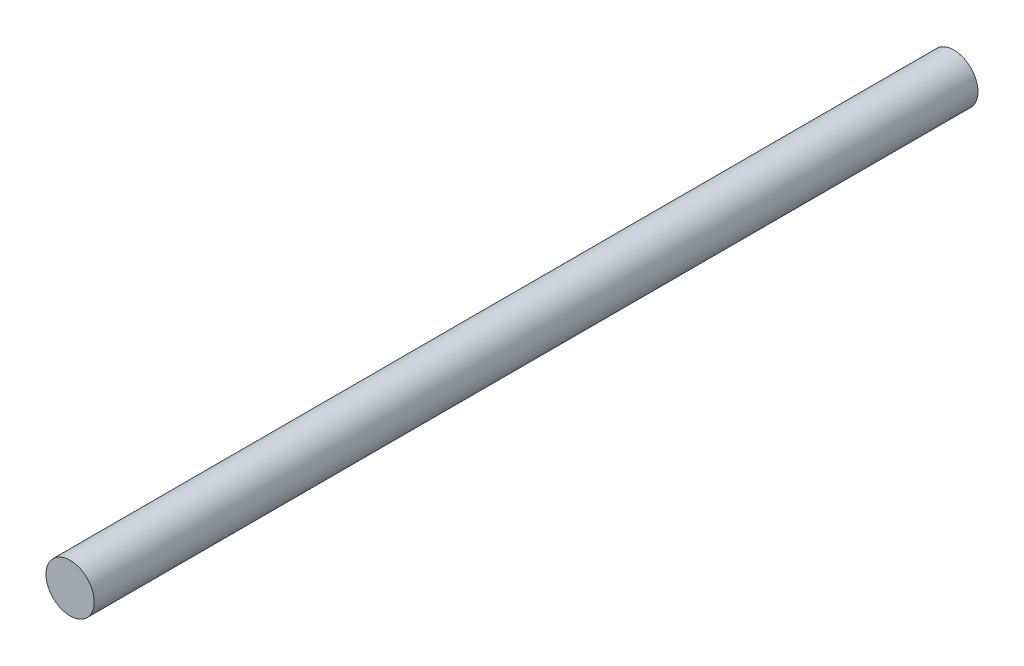
ISO-10303-21;
HEADER;
FILE_DESCRIPTION(('STEP AP214'),'2;1');
FILE_NAME('part.step','',(''),(''),'','','');
FILE_SCHEMA(('AUTOMOTIVE_DESIGN { 1 0 10303 214 1 1 1 1 }'));
ENDSEC;
DATA;
#1=APPLICATION_CONTEXT('core data for automotive mechanical design processes');
#2=APPLICATION_PROTOCOL_DEFINITION('international standard','automotive_design',2000,#1);
#3=PRODUCT_CONTEXT('',#1,'mechanical');
#4=PRODUCT('Part','Part','',(#3));
#5=PRODUCT_RELATED_PRODUCT_CATEGORY('part','',(#4));
#6=PRODUCT_DEFINITION_FORMATION('','',#4);
#7=PRODUCT_DEFINITION_CONTEXT('part definition',#1,'design');
#8=PRODUCT_DEFINITION('design','',#6,#7);
#9=PRODUCT_DEFINITION_SHAPE('','',#8);
#10=(LENGTH_UNIT() NAMED_UNIT(*) SI_UNIT(.MILLI.,.METRE.));
#11=(NAMED_UNIT(*) PLANE_ANGLE_UNIT() SI_UNIT($,.RADIAN.));
#12=(NAMED_UNIT(*) SI_UNIT($,.STERADIAN.) SOLID_ANGLE_UNIT());
#13=UNCERTAINTY_MEASURE_WITH_UNIT(LENGTH_MEASURE(1.E-05),#10,'distance_accuracy_value','');
#14=(GEOMETRIC_REPRESENTATION_CONTEXT(3) GLOBAL_UNCERTAINTY_ASSIGNED_CONTEXT((#13)) GLOBAL_UNIT_ASSIGNED_CONTEXT((#10,
#11,#12)) REPRESENTATION_CONTEXT('',''));
#15=CARTESIAN_POINT('',(0.,0.,0.));
#16=DIRECTION('',(0.,0.,1.));
#17=DIRECTION('',(1.,0.,0.));
#18=AXIS2_PLACEMENT_3D('',#15,#16,#17);
#19=CARTESIAN_POINT('',(0.,0.,293.));
#20=DIRECTION('',(0.,0.,-1.));
#21=DIRECTION('',(-1.,0.,0.));
#22=AXIS2_PLACEMENT_3D('',#19,#20,#21);
#23=CYLINDRICAL_SURFACE('',#22,8.);
#24=CARTESIAN_POINT('',(0.,0.,293.));
#25=DIRECTION('',(0.,0.,1.));
#26=DIRECTION('',(1.,0.,0.));
#27=AXIS2_PLACEMENT_3D('',#24,#25,#26);
#28=CIRCLE('',#27,8.);
#29=CARTESIAN_POINT('',(8.,0.,293.));
#30=VERTEX_POINT('',#29);
#31=EDGE_CURVE('E10',#30,#30,#28,.T.);
#32=ORIENTED_EDGE('',*,*,#31,.F.);
#33=EDGE_LOOP('',(#32));
#34=FACE_BOUND('',#33,.T.);
#35=CARTESIAN_POINT('',(0.,0.,0.));
#36=DIRECTION('',(0.,0.,1.));
#37=DIRECTION('',(1.,0.,0.));
#38=AXIS2_PLACEMENT_3D('',#35,#36,#37);
#39=CIRCLE('',#38,8.);
#40=CARTESIAN_POINT('',(8.,0.,0.));
#41=VERTEX_POINT('',#40);
#42=EDGE_CURVE('E36',#41,#41,#39,.T.);
#43=ORIENTED_EDGE('',*,*,#42,.T.);
#44=EDGE_LOOP('',(#43));
#45=FACE_BOUND('',#44,.T.);
#46=ADVANCED_FACE('F33',(#34,#45),#23,.T.);
#47=CARTESIAN_POINT('',(0.,0.,293.));
#48=DIRECTION('',(0.,0.,1.));
#49=DIRECTION('',(1.,0.,0.));
#50=AXIS2_PLACEMENT_3D('',#47,#48,#49);
#51=PLANE('',#50);
#52=ORIENTED_EDGE('',*,*,#31,.T.);
#53=EDGE_LOOP('',(#52));
#54=FACE_BOUND('',#53,.T.);
#55=ADVANCED_FACE('F48',(#54),#51,.T.);
#56=CARTESIAN_POINT('',(0.,0.,0.));
#57=DIRECTION('',(0.,0.,1.));
#58=DIRECTION('',(1.,0.,0.));
#59=AXIS2_PLACEMENT_3D('',#56,#57,#58);
#60=PLANE('',#59);
#61=ORIENTED_EDGE('',*,*,#42,.F.);
#62=EDGE_LOOP('',(#61));
#63=FACE_BOUND('',#62,.T.);
#64=ADVANCED_FACE('F46',(#63),#60,.F.);
#65=CLOSED_SHELL('',(#46,#55,#64));
#66=MANIFOLD_SOLID_BREP('B2',#65);
#67=ADVANCED_BREP_SHAPE_REPRESENTATION('',(#18,#66),#14);
#68=SHAPE_DEFINITION_REPRESENTATION(#9,#67);
ENDSEC;
END-ISO-10303-21;
